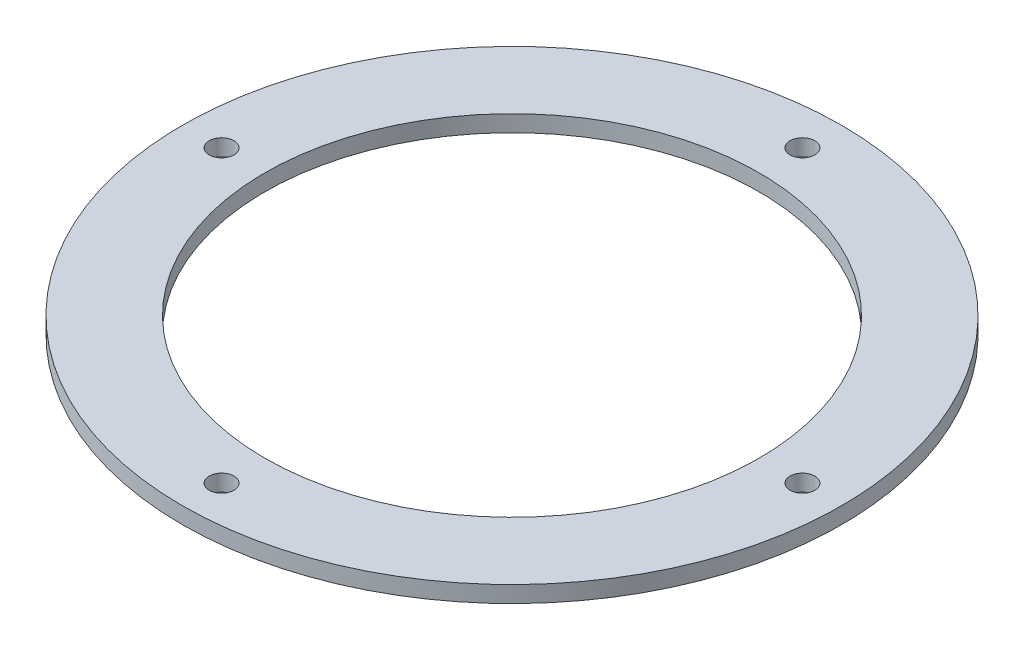
ISO-10303-21;
HEADER;
FILE_DESCRIPTION(('STEP AP214'),'2;1');
FILE_NAME('part.step','',(''),(''),'','','');
FILE_SCHEMA(('AUTOMOTIVE_DESIGN { 1 0 10303 214 1 1 1 1 }'));
ENDSEC;
DATA;
#1=APPLICATION_CONTEXT('core data for automotive mechanical design processes');
#2=APPLICATION_PROTOCOL_DEFINITION('international standard','automotive_design',2000,#1);
#3=PRODUCT_CONTEXT('',#1,'mechanical');
#4=PRODUCT('Part','Part','',(#3));
#5=PRODUCT_RELATED_PRODUCT_CATEGORY('part','',(#4));
#6=PRODUCT_DEFINITION_FORMATION('','',#4);
#7=PRODUCT_DEFINITION_CONTEXT('part definition',#1,'design');
#8=PRODUCT_DEFINITION('design','',#6,#7);
#9=PRODUCT_DEFINITION_SHAPE('','',#8);
#10=(LENGTH_UNIT() NAMED_UNIT(*) SI_UNIT(.MILLI.,.METRE.));
#11=(NAMED_UNIT(*) PLANE_ANGLE_UNIT() SI_UNIT($,.RADIAN.));
#12=(NAMED_UNIT(*) SI_UNIT($,.STERADIAN.) SOLID_ANGLE_UNIT());
#13=UNCERTAINTY_MEASURE_WITH_UNIT(LENGTH_MEASURE(1.E-05),#10,'distance_accuracy_value','');
#14=(GEOMETRIC_REPRESENTATION_CONTEXT(3) GLOBAL_UNCERTAINTY_ASSIGNED_CONTEXT((#13)) GLOBAL_UNIT_ASSIGNED_CONTEXT((#10,
#11,#12)) REPRESENTATION_CONTEXT('',''));
#15=CARTESIAN_POINT('',(0.,0.,0.));
#16=DIRECTION('',(0.,0.,1.));
#17=DIRECTION('',(1.,0.,0.));
#18=AXIS2_PLACEMENT_3D('',#15,#16,#17);
#19=CARTESIAN_POINT('',(0.,2.,0.));
#20=DIRECTION('',(0.,1.,0.));
#21=DIRECTION('',(0.,0.,1.));
#22=AXIS2_PLACEMENT_3D('',#19,#20,#21);
#23=PLANE('',#22);
#24=CARTESIAN_POINT('',(-35.25,2.,0.));
#25=DIRECTION('',(0.,1.,0.));
#26=DIRECTION('',(0.,0.,1.));
#27=AXIS2_PLACEMENT_3D('',#24,#25,#26);
#28=CIRCLE('',#27,1.5);
#29=CARTESIAN_POINT('',(-35.25,2.,1.5));
#30=VERTEX_POINT('',#29);
#31=EDGE_CURVE('E67',#30,#30,#28,.T.);
#32=ORIENTED_EDGE('',*,*,#31,.F.);
#33=EDGE_LOOP('',(#32));
#34=FACE_BOUND('',#33,.T.);
#35=CARTESIAN_POINT('',(1.2307471719422E-13,2.,-35.25));
#36=DIRECTION('',(0.,1.,0.));
#37=DIRECTION('',(0.,0.,1.));
#38=AXIS2_PLACEMENT_3D('',#35,#36,#37);
#39=CIRCLE('',#38,1.5);
#40=CARTESIAN_POINT('',(1.2307471719422E-13,2.,-33.75));
#41=VERTEX_POINT('',#40);
#42=EDGE_CURVE('E61',#41,#41,#39,.T.);
#43=ORIENTED_EDGE('',*,*,#42,.F.);
#44=EDGE_LOOP('',(#43));
#45=FACE_BOUND('',#44,.T.);
#46=CARTESIAN_POINT('',(35.25,2.,2.46149434388441E-13));
#47=DIRECTION('',(0.,1.,0.));
#48=DIRECTION('',(0.,0.,1.));
#49=AXIS2_PLACEMENT_3D('',#46,#47,#48);
#50=CIRCLE('',#49,1.5);
#51=CARTESIAN_POINT('',(35.25,2.,1.50000000000025));
#52=VERTEX_POINT('',#51);
#53=EDGE_CURVE('E55',#52,#52,#50,.T.);
#54=ORIENTED_EDGE('',*,*,#53,.F.);
#55=EDGE_LOOP('',(#54));
#56=FACE_BOUND('',#55,.T.);
#57=CARTESIAN_POINT('',(-3.69224151582661E-13,2.,35.25));
#58=DIRECTION('',(0.,1.,0.));
#59=DIRECTION('',(0.,0.,1.));
#60=AXIS2_PLACEMENT_3D('',#57,#58,#59);
#61=CIRCLE('',#60,1.50000000000001);
#62=CARTESIAN_POINT('',(-3.69224151582661E-13,2.,36.75));
#63=VERTEX_POINT('',#62);
#64=EDGE_CURVE('E49',#63,#63,#61,.T.);
#65=ORIENTED_EDGE('',*,*,#64,.F.);
#66=EDGE_LOOP('',(#65));
#67=FACE_BOUND('',#66,.T.);
#68=CARTESIAN_POINT('',(0.,2.,0.));
#69=DIRECTION('',(0.,1.,0.));
#70=DIRECTION('',(0.,0.,1.));
#71=AXIS2_PLACEMENT_3D('',#68,#69,#70);
#72=CIRCLE('',#71,40.);
#73=CARTESIAN_POINT('',(0.,2.,40.));
#74=VERTEX_POINT('',#73);
#75=EDGE_CURVE('E10',#74,#74,#72,.T.);
#76=ORIENTED_EDGE('',*,*,#75,.T.);
#77=EDGE_LOOP('',(#76));
#78=FACE_BOUND('',#77,.T.);
#79=CARTESIAN_POINT('',(0.,2.,0.));
#80=DIRECTION('',(0.,1.,0.));
#81=DIRECTION('',(0.,0.,1.));
#82=AXIS2_PLACEMENT_3D('',#79,#80,#81);
#83=CIRCLE('',#82,30.);
#84=CARTESIAN_POINT('',(0.,2.,30.));
#85=VERTEX_POINT('',#84);
#86=EDGE_CURVE('E41',#85,#85,#83,.T.);
#87=ORIENTED_EDGE('',*,*,#86,.F.);
#88=EDGE_LOOP('',(#87));
#89=FACE_BOUND('',#88,.T.);
#90=ADVANCED_FACE('F30',(#34,#45,#56,#67,#78,#89),#23,.T.);
#91=CARTESIAN_POINT('',(0.,0.,0.));
#92=DIRECTION('',(0.,1.,0.));
#93=DIRECTION('',(0.,0.,1.));
#94=AXIS2_PLACEMENT_3D('',#91,#92,#93);
#95=PLANE('',#94);
#96=CARTESIAN_POINT('',(-35.25,0.,0.));
#97=DIRECTION('',(0.,1.,0.));
#98=DIRECTION('',(0.,0.,1.));
#99=AXIS2_PLACEMENT_3D('',#96,#97,#98);
#100=CIRCLE('',#99,1.5);
#101=CARTESIAN_POINT('',(-35.25,0.,1.5));
#102=VERTEX_POINT('',#101);
#103=EDGE_CURVE('E46',#102,#102,#100,.T.);
#104=ORIENTED_EDGE('',*,*,#103,.T.);
#105=EDGE_LOOP('',(#104));
#106=FACE_BOUND('',#105,.T.);
#107=CARTESIAN_POINT('',(1.2307471719422E-13,0.,-35.25));
#108=DIRECTION('',(0.,1.,0.));
#109=DIRECTION('',(0.,0.,1.));
#110=AXIS2_PLACEMENT_3D('',#107,#108,#109);
#111=CIRCLE('',#110,1.5);
#112=CARTESIAN_POINT('',(1.2307471719422E-13,0.,-33.75));
#113=VERTEX_POINT('',#112);
#114=EDGE_CURVE('E64',#113,#113,#111,.T.);
#115=ORIENTED_EDGE('',*,*,#114,.T.);
#116=EDGE_LOOP('',(#115));
#117=FACE_BOUND('',#116,.T.);
#118=CARTESIAN_POINT('',(35.25,0.,2.46149434388441E-13));
#119=DIRECTION('',(0.,1.,0.));
#120=DIRECTION('',(0.,0.,1.));
#121=AXIS2_PLACEMENT_3D('',#118,#119,#120);
#122=CIRCLE('',#121,1.5);
#123=CARTESIAN_POINT('',(35.25,0.,1.50000000000025));
#124=VERTEX_POINT('',#123);
#125=EDGE_CURVE('E58',#124,#124,#122,.T.);
#126=ORIENTED_EDGE('',*,*,#125,.T.);
#127=EDGE_LOOP('',(#126));
#128=FACE_BOUND('',#127,.T.);
#129=CARTESIAN_POINT('',(-3.69224151582661E-13,0.,35.25));
#130=DIRECTION('',(0.,1.,0.));
#131=DIRECTION('',(0.,0.,1.));
#132=AXIS2_PLACEMENT_3D('',#129,#130,#131);
#133=CIRCLE('',#132,1.50000000000001);
#134=CARTESIAN_POINT('',(-3.69224151582661E-13,0.,36.75));
#135=VERTEX_POINT('',#134);
#136=EDGE_CURVE('E52',#135,#135,#133,.T.);
#137=ORIENTED_EDGE('',*,*,#136,.T.);
#138=EDGE_LOOP('',(#137));
#139=FACE_BOUND('',#138,.T.);
#140=CARTESIAN_POINT('',(0.,0.,0.));
#141=DIRECTION('',(0.,1.,0.));
#142=DIRECTION('',(0.,0.,1.));
#143=AXIS2_PLACEMENT_3D('',#140,#141,#142);
#144=CIRCLE('',#143,40.);
#145=CARTESIAN_POINT('',(0.,0.,40.));
#146=VERTEX_POINT('',#145);
#147=EDGE_CURVE('E34',#146,#146,#144,.T.);
#148=ORIENTED_EDGE('',*,*,#147,.F.);
#149=EDGE_LOOP('',(#148));
#150=FACE_BOUND('',#149,.T.);
#151=CARTESIAN_POINT('',(0.,0.,0.));
#152=DIRECTION('',(0.,1.,0.));
#153=DIRECTION('',(0.,0.,1.));
#154=AXIS2_PLACEMENT_3D('',#151,#152,#153);
#155=CIRCLE('',#154,30.);
#156=CARTESIAN_POINT('',(0.,0.,30.));
#157=VERTEX_POINT('',#156);
#158=EDGE_CURVE('E43',#157,#157,#155,.T.);
#159=ORIENTED_EDGE('',*,*,#158,.T.);
#160=EDGE_LOOP('',(#159));
#161=FACE_BOUND('',#160,.T.);
#162=ADVANCED_FACE('F73',(#106,#117,#128,#139,#150,#161),#95,.F.);
#163=CARTESIAN_POINT('',(0.,2.,0.));
#164=DIRECTION('',(0.,-1.,0.));
#165=DIRECTION('',(0.,0.,-1.));
#166=AXIS2_PLACEMENT_3D('',#163,#164,#165);
#167=CYLINDRICAL_SURFACE('',#166,40.);
#168=ORIENTED_EDGE('',*,*,#75,.F.);
#169=EDGE_LOOP('',(#168));
#170=FACE_BOUND('',#169,.T.);
#171=ORIENTED_EDGE('',*,*,#147,.T.);
#172=EDGE_LOOP('',(#171));
#173=FACE_BOUND('',#172,.T.);
#174=ADVANCED_FACE('F32',(#170,#173),#167,.T.);
#175=CARTESIAN_POINT('',(0.,2.,0.));
#176=DIRECTION('',(0.,-1.,0.));
#177=DIRECTION('',(0.,0.,-1.));
#178=AXIS2_PLACEMENT_3D('',#175,#176,#177);
#179=CYLINDRICAL_SURFACE('',#178,30.);
#180=ORIENTED_EDGE('',*,*,#86,.T.);
#181=EDGE_LOOP('',(#180));
#182=FACE_BOUND('',#181,.T.);
#183=ORIENTED_EDGE('',*,*,#158,.F.);
#184=EDGE_LOOP('',(#183));
#185=FACE_BOUND('',#184,.T.);
#186=ADVANCED_FACE('F94',(#182,#185),#179,.F.);
#187=CARTESIAN_POINT('',(-3.69224151582661E-13,0.,35.25));
#188=DIRECTION('',(0.,1.,0.));
#189=DIRECTION('',(0.,0.,1.));
#190=AXIS2_PLACEMENT_3D('',#187,#188,#189);
#191=CYLINDRICAL_SURFACE('',#190,1.50000000000001);
#192=ORIENTED_EDGE('',*,*,#136,.F.);
#193=EDGE_LOOP('',(#192));
#194=FACE_BOUND('',#193,.T.);
#195=ORIENTED_EDGE('',*,*,#64,.T.);
#196=EDGE_LOOP('',(#195));
#197=FACE_BOUND('',#196,.T.);
#198=ADVANCED_FACE('F97',(#194,#197),#191,.F.);
#199=CARTESIAN_POINT('',(35.25,0.,2.46149434388441E-13));
#200=DIRECTION('',(0.,1.,0.));
#201=DIRECTION('',(0.,0.,1.));
#202=AXIS2_PLACEMENT_3D('',#199,#200,#201);
#203=CYLINDRICAL_SURFACE('',#202,1.5);
#204=ORIENTED_EDGE('',*,*,#125,.F.);
#205=EDGE_LOOP('',(#204));
#206=FACE_BOUND('',#205,.T.);
#207=ORIENTED_EDGE('',*,*,#53,.T.);
#208=EDGE_LOOP('',(#207));
#209=FACE_BOUND('',#208,.T.);
#210=ADVANCED_FACE('F109',(#206,#209),#203,.F.);
#211=CARTESIAN_POINT('',(1.2307471719422E-13,0.,-35.25));
#212=DIRECTION('',(0.,1.,0.));
#213=DIRECTION('',(0.,0.,1.));
#214=AXIS2_PLACEMENT_3D('',#211,#212,#213);
#215=CYLINDRICAL_SURFACE('',#214,1.5);
#216=ORIENTED_EDGE('',*,*,#114,.F.);
#217=EDGE_LOOP('',(#216));
#218=FACE_BOUND('',#217,.T.);
#219=ORIENTED_EDGE('',*,*,#42,.T.);
#220=EDGE_LOOP('',(#219));
#221=FACE_BOUND('',#220,.T.);
#222=ADVANCED_FACE('F79',(#218,#221),#215,.F.);
#223=CARTESIAN_POINT('',(-35.25,0.,0.));
#224=DIRECTION('',(0.,1.,0.));
#225=DIRECTION('',(0.,0.,1.));
#226=AXIS2_PLACEMENT_3D('',#223,#224,#225);
#227=CYLINDRICAL_SURFACE('',#226,1.5);
#228=ORIENTED_EDGE('',*,*,#103,.F.);
#229=EDGE_LOOP('',(#228));
#230=FACE_BOUND('',#229,.T.);
#231=ORIENTED_EDGE('',*,*,#31,.T.);
#232=EDGE_LOOP('',(#231));
#233=FACE_BOUND('',#232,.T.);
#234=ADVANCED_FACE('F76',(#230,#233),#227,.F.);
#235=CLOSED_SHELL('',(#90,#162,#174,#186,#198,#210,#222,#234));
#236=MANIFOLD_SOLID_BREP('B2',#235);
#237=ADVANCED_BREP_SHAPE_REPRESENTATION('',(#18,#236),#14);
#238=SHAPE_DEFINITION_REPRESENTATION(#9,#237);
ENDSEC;
END-ISO-10303-21;
